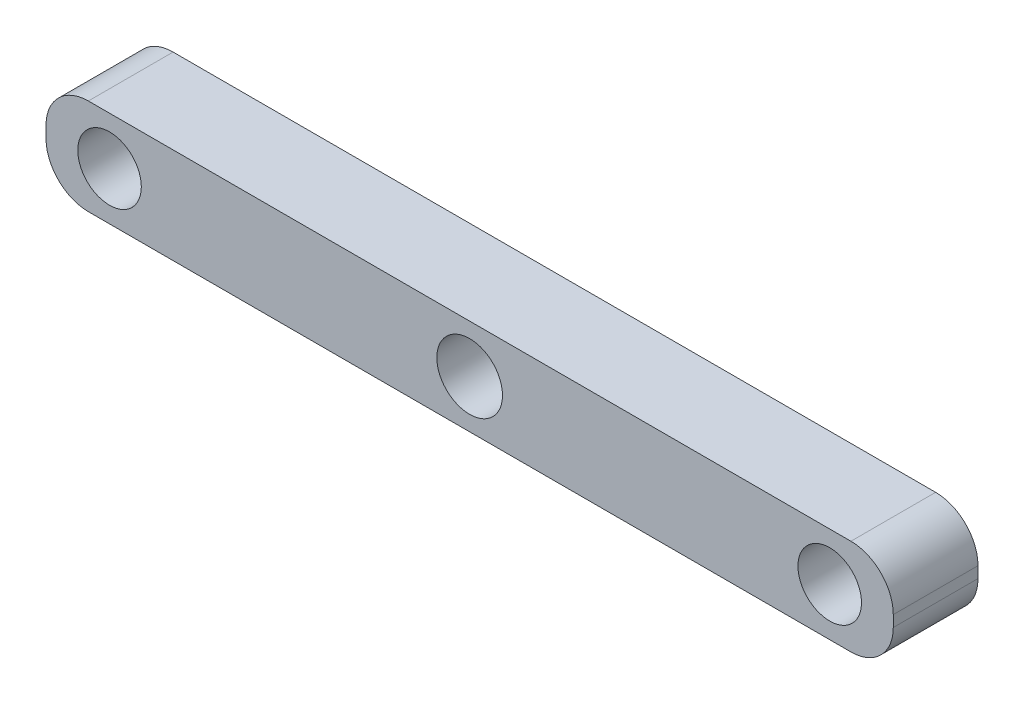
ISO-10303-21;
HEADER;
FILE_DESCRIPTION(('STEP AP214'),'2;1');
FILE_NAME('part.step','',(''),(''),'','','');
FILE_SCHEMA(('AUTOMOTIVE_DESIGN { 1 0 10303 214 1 1 1 1 }'));
ENDSEC;
DATA;
#1=APPLICATION_CONTEXT('core data for automotive mechanical design processes');
#2=APPLICATION_PROTOCOL_DEFINITION('international standard','automotive_design',2000,#1);
#3=PRODUCT_CONTEXT('',#1,'mechanical');
#4=PRODUCT('Part','Part','',(#3));
#5=PRODUCT_RELATED_PRODUCT_CATEGORY('part','',(#4));
#6=PRODUCT_DEFINITION_FORMATION('','',#4);
#7=PRODUCT_DEFINITION_CONTEXT('part definition',#1,'design');
#8=PRODUCT_DEFINITION('design','',#6,#7);
#9=PRODUCT_DEFINITION_SHAPE('','',#8);
#10=(LENGTH_UNIT() NAMED_UNIT(*) SI_UNIT(.MILLI.,.METRE.));
#11=(NAMED_UNIT(*) PLANE_ANGLE_UNIT() SI_UNIT($,.RADIAN.));
#12=(NAMED_UNIT(*) SI_UNIT($,.STERADIAN.) SOLID_ANGLE_UNIT());
#13=UNCERTAINTY_MEASURE_WITH_UNIT(LENGTH_MEASURE(1.E-05),#10,'distance_accuracy_value','');
#14=(GEOMETRIC_REPRESENTATION_CONTEXT(3) GLOBAL_UNCERTAINTY_ASSIGNED_CONTEXT((#13)) GLOBAL_UNIT_ASSIGNED_CONTEXT((#10,
#11,#12)) REPRESENTATION_CONTEXT('',''));
#15=CARTESIAN_POINT('',(0.,0.,0.));
#16=DIRECTION('',(0.,0.,1.));
#17=DIRECTION('',(1.,0.,0.));
#18=AXIS2_PLACEMENT_3D('',#15,#16,#17);
#19=CARTESIAN_POINT('',(18.,-0.263569898447118,4.));
#20=DIRECTION('',(0.,0.,1.));
#21=DIRECTION('',(1.,0.,0.));
#22=AXIS2_PLACEMENT_3D('',#19,#20,#21);
#23=PLANE('',#22);
#24=CARTESIAN_POINT('',(-17.,0.,4.));
#25=DIRECTION('',(0.,0.,1.));
#26=DIRECTION('',(1.,0.,0.));
#27=AXIS2_PLACEMENT_3D('',#24,#25,#26);
#28=CIRCLE('',#27,1.5);
#29=CARTESIAN_POINT('',(-15.5,0.,4.));
#30=VERTEX_POINT('',#29);
#31=EDGE_CURVE('E183',#30,#30,#28,.T.);
#32=ORIENTED_EDGE('',*,*,#31,.F.);
#33=EDGE_LOOP('',(#32));
#34=FACE_BOUND('',#33,.T.);
#35=CARTESIAN_POINT('',(18.,-0.263569898447118,4.));
#36=DIRECTION('',(0.,0.,1.));
#37=DIRECTION('',(1.,0.,0.));
#38=AXIS2_PLACEMENT_3D('',#35,#36,#37);
#39=CIRCLE('',#38,2.);
#40=CARTESIAN_POINT('',(18.,-2.26356989844712,4.));
#41=VERTEX_POINT('',#40);
#42=CARTESIAN_POINT('',(20.,-0.263569898447104,4.));
#43=VERTEX_POINT('',#42);
#44=EDGE_CURVE('E146',#41,#43,#39,.T.);
#45=ORIENTED_EDGE('',*,*,#44,.T.);
#46=DIRECTION('',(0.,1.,0.));
#47=VECTOR('',#46,1.);
#48=CARTESIAN_POINT('',(20.,-0.263569898447104,4.));
#49=LINE('',#48,#47);
#50=CARTESIAN_POINT('',(20.,0.263569898447104,4.));
#51=VERTEX_POINT('',#50);
#52=EDGE_CURVE('E94',#43,#51,#49,.T.);
#53=ORIENTED_EDGE('',*,*,#52,.T.);
#54=CARTESIAN_POINT('',(18.,0.263569898447118,4.));
#55=DIRECTION('',(0.,0.,1.));
#56=DIRECTION('',(-1.,0.,0.));
#57=AXIS2_PLACEMENT_3D('',#54,#55,#56);
#58=CIRCLE('',#57,2.);
#59=CARTESIAN_POINT('',(18.,2.26356989844712,4.));
#60=VERTEX_POINT('',#59);
#61=EDGE_CURVE('E161',#51,#60,#58,.T.);
#62=ORIENTED_EDGE('',*,*,#61,.T.);
#63=DIRECTION('',(-1.,0.,0.));
#64=VECTOR('',#63,1.);
#65=CARTESIAN_POINT('',(-18.,2.26356989844712,4.));
#66=LINE('',#65,#64);
#67=CARTESIAN_POINT('',(-18.,2.26356989844712,4.));
#68=VERTEX_POINT('',#67);
#69=EDGE_CURVE('E174',#60,#68,#66,.T.);
#70=ORIENTED_EDGE('',*,*,#69,.T.);
#71=CARTESIAN_POINT('',(-18.,0.263569898447118,4.));
#72=DIRECTION('',(0.,0.,1.));
#73=DIRECTION('',(-1.,0.,0.));
#74=AXIS2_PLACEMENT_3D('',#71,#72,#73);
#75=CIRCLE('',#74,2.);
#76=CARTESIAN_POINT('',(-20.,0.263569898447104,4.));
#77=VERTEX_POINT('',#76);
#78=EDGE_CURVE('E113',#68,#77,#75,.T.);
#79=ORIENTED_EDGE('',*,*,#78,.T.);
#80=DIRECTION('',(0.,-1.,0.));
#81=VECTOR('',#80,1.);
#82=CARTESIAN_POINT('',(-20.,-0.263569898447104,4.));
#83=LINE('',#82,#81);
#84=CARTESIAN_POINT('',(-20.,-0.263569898447118,4.));
#85=VERTEX_POINT('',#84);
#86=EDGE_CURVE('E107',#77,#85,#83,.T.);
#87=ORIENTED_EDGE('',*,*,#86,.T.);
#88=CARTESIAN_POINT('',(-18.,-0.263569898447118,4.));
#89=DIRECTION('',(0.,0.,1.));
#90=DIRECTION('',(-1.,0.,0.));
#91=AXIS2_PLACEMENT_3D('',#88,#89,#90);
#92=CIRCLE('',#91,2.);
#93=CARTESIAN_POINT('',(-18.,-2.26356989844712,4.));
#94=VERTEX_POINT('',#93);
#95=EDGE_CURVE('E111',#85,#94,#92,.T.);
#96=ORIENTED_EDGE('',*,*,#95,.T.);
#97=DIRECTION('',(1.,0.,0.));
#98=VECTOR('',#97,1.);
#99=CARTESIAN_POINT('',(-18.,-2.26356989844712,4.));
#100=LINE('',#99,#98);
#101=EDGE_CURVE('E51',#94,#41,#100,.T.);
#102=ORIENTED_EDGE('',*,*,#101,.T.);
#103=EDGE_LOOP('',(#45,#53,#62,#70,#79,#87,#96,#102));
#104=FACE_BOUND('',#103,.T.);
#105=CARTESIAN_POINT('',(0.,0.,4.));
#106=DIRECTION('',(0.,0.,1.));
#107=DIRECTION('',(1.,0.,0.));
#108=AXIS2_PLACEMENT_3D('',#105,#106,#107);
#109=CIRCLE('',#108,1.55);
#110=CARTESIAN_POINT('',(1.55,0.,4.));
#111=VERTEX_POINT('',#110);
#112=EDGE_CURVE('E135',#111,#111,#109,.T.);
#113=ORIENTED_EDGE('',*,*,#112,.F.);
#114=EDGE_LOOP('',(#113));
#115=FACE_BOUND('',#114,.T.);
#116=CARTESIAN_POINT('',(17.,0.,4.));
#117=DIRECTION('',(0.,0.,1.));
#118=DIRECTION('',(-1.,0.,0.));
#119=AXIS2_PLACEMENT_3D('',#116,#117,#118);
#120=CIRCLE('',#119,1.5);
#121=CARTESIAN_POINT('',(15.5,0.,4.));
#122=VERTEX_POINT('',#121);
#123=EDGE_CURVE('E189',#122,#122,#120,.T.);
#124=ORIENTED_EDGE('',*,*,#123,.F.);
#125=EDGE_LOOP('',(#124));
#126=FACE_BOUND('',#125,.T.);
#127=ADVANCED_FACE('F34',(#34,#104,#115,#126),#23,.T.);
#128=CARTESIAN_POINT('',(18.,-0.263569898447118,0.));
#129=DIRECTION('',(0.,0.,1.));
#130=DIRECTION('',(1.,0.,0.));
#131=AXIS2_PLACEMENT_3D('',#128,#129,#130);
#132=PLANE('',#131);
#133=CARTESIAN_POINT('',(18.,-0.263569898447118,0.));
#134=DIRECTION('',(0.,0.,1.));
#135=DIRECTION('',(1.,0.,0.));
#136=AXIS2_PLACEMENT_3D('',#133,#134,#135);
#137=CIRCLE('',#136,2.);
#138=CARTESIAN_POINT('',(18.,-2.26356989844712,0.));
#139=VERTEX_POINT('',#138);
#140=CARTESIAN_POINT('',(20.,-0.263569898447104,0.));
#141=VERTEX_POINT('',#140);
#142=EDGE_CURVE('E131',#139,#141,#137,.T.);
#143=ORIENTED_EDGE('',*,*,#142,.F.);
#144=DIRECTION('',(1.,0.,0.));
#145=VECTOR('',#144,1.);
#146=CARTESIAN_POINT('',(-18.,-2.26356989844712,0.));
#147=LINE('',#146,#145);
#148=CARTESIAN_POINT('',(-18.,-2.26356989844712,0.));
#149=VERTEX_POINT('',#148);
#150=EDGE_CURVE('E86',#149,#139,#147,.T.);
#151=ORIENTED_EDGE('',*,*,#150,.F.);
#152=CARTESIAN_POINT('',(-18.,-0.263569898447118,0.));
#153=DIRECTION('',(0.,0.,1.));
#154=DIRECTION('',(-1.,0.,0.));
#155=AXIS2_PLACEMENT_3D('',#152,#153,#154);
#156=CIRCLE('',#155,2.);
#157=CARTESIAN_POINT('',(-20.,-0.263569898447118,0.));
#158=VERTEX_POINT('',#157);
#159=EDGE_CURVE('E80',#158,#149,#156,.T.);
#160=ORIENTED_EDGE('',*,*,#159,.F.);
#161=DIRECTION('',(0.,-1.,0.));
#162=VECTOR('',#161,1.);
#163=CARTESIAN_POINT('',(-20.,-0.263569898447104,0.));
#164=LINE('',#163,#162);
#165=CARTESIAN_POINT('',(-20.,0.263569898447104,0.));
#166=VERTEX_POINT('',#165);
#167=EDGE_CURVE('E121',#166,#158,#164,.T.);
#168=ORIENTED_EDGE('',*,*,#167,.F.);
#169=CARTESIAN_POINT('',(-18.,0.263569898447118,0.));
#170=DIRECTION('',(0.,0.,1.));
#171=DIRECTION('',(-1.,0.,0.));
#172=AXIS2_PLACEMENT_3D('',#169,#170,#171);
#173=CIRCLE('',#172,2.);
#174=CARTESIAN_POINT('',(-18.,2.26356989844712,0.));
#175=VERTEX_POINT('',#174);
#176=EDGE_CURVE('E141',#175,#166,#173,.T.);
#177=ORIENTED_EDGE('',*,*,#176,.F.);
#178=DIRECTION('',(-1.,0.,0.));
#179=VECTOR('',#178,1.);
#180=CARTESIAN_POINT('',(-18.,2.26356989844712,0.));
#181=LINE('',#180,#179);
#182=CARTESIAN_POINT('',(18.,2.26356989844712,0.));
#183=VERTEX_POINT('',#182);
#184=EDGE_CURVE('E139',#183,#175,#181,.T.);
#185=ORIENTED_EDGE('',*,*,#184,.F.);
#186=CARTESIAN_POINT('',(18.,0.263569898447118,0.));
#187=DIRECTION('',(0.,0.,1.));
#188=DIRECTION('',(-1.,0.,0.));
#189=AXIS2_PLACEMENT_3D('',#186,#187,#188);
#190=CIRCLE('',#189,2.);
#191=CARTESIAN_POINT('',(20.,0.263569898447104,0.));
#192=VERTEX_POINT('',#191);
#193=EDGE_CURVE('E137',#192,#183,#190,.T.);
#194=ORIENTED_EDGE('',*,*,#193,.F.);
#195=DIRECTION('',(0.,1.,0.));
#196=VECTOR('',#195,1.);
#197=CARTESIAN_POINT('',(20.,-0.263569898447104,0.));
#198=LINE('',#197,#196);
#199=EDGE_CURVE('E134',#141,#192,#198,.T.);
#200=ORIENTED_EDGE('',*,*,#199,.F.);
#201=EDGE_LOOP('',(#143,#151,#160,#168,#177,#185,#194,#200));
#202=FACE_BOUND('',#201,.T.);
#203=CARTESIAN_POINT('',(0.,0.,0.));
#204=DIRECTION('',(0.,0.,1.));
#205=DIRECTION('',(1.,0.,0.));
#206=AXIS2_PLACEMENT_3D('',#203,#204,#205);
#207=CIRCLE('',#206,1.55);
#208=CARTESIAN_POINT('',(1.55,0.,0.));
#209=VERTEX_POINT('',#208);
#210=EDGE_CURVE('E180',#209,#209,#207,.T.);
#211=ORIENTED_EDGE('',*,*,#210,.T.);
#212=EDGE_LOOP('',(#211));
#213=FACE_BOUND('',#212,.T.);
#214=CARTESIAN_POINT('',(-17.,0.,0.));
#215=DIRECTION('',(0.,0.,1.));
#216=DIRECTION('',(1.,0.,0.));
#217=AXIS2_PLACEMENT_3D('',#214,#215,#216);
#218=CIRCLE('',#217,1.5);
#219=CARTESIAN_POINT('',(-15.5,0.,0.));
#220=VERTEX_POINT('',#219);
#221=EDGE_CURVE('E186',#220,#220,#218,.T.);
#222=ORIENTED_EDGE('',*,*,#221,.T.);
#223=EDGE_LOOP('',(#222));
#224=FACE_BOUND('',#223,.T.);
#225=CARTESIAN_POINT('',(17.,0.,0.));
#226=DIRECTION('',(0.,0.,1.));
#227=DIRECTION('',(-1.,0.,0.));
#228=AXIS2_PLACEMENT_3D('',#225,#226,#227);
#229=CIRCLE('',#228,1.5);
#230=CARTESIAN_POINT('',(15.5,0.,0.));
#231=VERTEX_POINT('',#230);
#232=EDGE_CURVE('E192',#231,#231,#229,.T.);
#233=ORIENTED_EDGE('',*,*,#232,.T.);
#234=EDGE_LOOP('',(#233));
#235=FACE_BOUND('',#234,.T.);
#236=ADVANCED_FACE('F165',(#202,#213,#224,#235),#132,.F.);
#237=CARTESIAN_POINT('',(18.,-0.263569898447118,4.));
#238=DIRECTION('',(0.,0.,-1.));
#239=DIRECTION('',(-1.,0.,0.));
#240=AXIS2_PLACEMENT_3D('',#237,#238,#239);
#241=CYLINDRICAL_SURFACE('',#240,2.);
#242=ORIENTED_EDGE('',*,*,#142,.T.);
#243=DIRECTION('',(0.,0.,-1.));
#244=VECTOR('',#243,1.);
#245=CARTESIAN_POINT('',(20.,-0.263569898447104,4.));
#246=LINE('',#245,#244);
#247=EDGE_CURVE('E11',#43,#141,#246,.T.);
#248=ORIENTED_EDGE('',*,*,#247,.F.);
#249=ORIENTED_EDGE('',*,*,#44,.F.);
#250=DIRECTION('',(0.,0.,-1.));
#251=VECTOR('',#250,1.);
#252=CARTESIAN_POINT('',(18.,-2.26356989844712,4.));
#253=LINE('',#252,#251);
#254=EDGE_CURVE('E127',#41,#139,#253,.T.);
#255=ORIENTED_EDGE('',*,*,#254,.T.);
#256=EDGE_LOOP('',(#242,#248,#249,#255));
#257=FACE_BOUND('',#256,.T.);
#258=ADVANCED_FACE('F36',(#257),#241,.T.);
#259=CARTESIAN_POINT('',(20.,-0.263569898447104,4.));
#260=DIRECTION('',(-1.,0.,0.));
#261=DIRECTION('',(0.,0.,1.));
#262=AXIS2_PLACEMENT_3D('',#259,#260,#261);
#263=PLANE('',#262);
#264=ORIENTED_EDGE('',*,*,#199,.T.);
#265=DIRECTION('',(0.,0.,-1.));
#266=VECTOR('',#265,1.);
#267=CARTESIAN_POINT('',(20.,0.263569898447104,4.));
#268=LINE('',#267,#266);
#269=EDGE_CURVE('E43',#51,#192,#268,.T.);
#270=ORIENTED_EDGE('',*,*,#269,.F.);
#271=ORIENTED_EDGE('',*,*,#52,.F.);
#272=ORIENTED_EDGE('',*,*,#247,.T.);
#273=EDGE_LOOP('',(#264,#270,#271,#272));
#274=FACE_BOUND('',#273,.T.);
#275=ADVANCED_FACE('F225',(#274),#263,.F.);
#276=CARTESIAN_POINT('',(18.,0.263569898447118,4.));
#277=DIRECTION('',(0.,0.,-1.));
#278=DIRECTION('',(-1.,0.,0.));
#279=AXIS2_PLACEMENT_3D('',#276,#277,#278);
#280=CYLINDRICAL_SURFACE('',#279,2.);
#281=ORIENTED_EDGE('',*,*,#193,.T.);
#282=DIRECTION('',(0.,0.,-1.));
#283=VECTOR('',#282,1.);
#284=CARTESIAN_POINT('',(18.,2.26356989844712,4.));
#285=LINE('',#284,#283);
#286=EDGE_CURVE('E153',#60,#183,#285,.T.);
#287=ORIENTED_EDGE('',*,*,#286,.F.);
#288=ORIENTED_EDGE('',*,*,#61,.F.);
#289=ORIENTED_EDGE('',*,*,#269,.T.);
#290=EDGE_LOOP('',(#281,#287,#288,#289));
#291=FACE_BOUND('',#290,.T.);
#292=ADVANCED_FACE('F159',(#291),#280,.T.);
#293=CARTESIAN_POINT('',(-18.,2.26356989844712,4.));
#294=DIRECTION('',(0.,-1.,0.));
#295=DIRECTION('',(0.,0.,-1.));
#296=AXIS2_PLACEMENT_3D('',#293,#294,#295);
#297=PLANE('',#296);
#298=ORIENTED_EDGE('',*,*,#184,.T.);
#299=DIRECTION('',(0.,0.,-1.));
#300=VECTOR('',#299,1.);
#301=CARTESIAN_POINT('',(-18.,2.26356989844712,4.));
#302=LINE('',#301,#300);
#303=EDGE_CURVE('E150',#68,#175,#302,.T.);
#304=ORIENTED_EDGE('',*,*,#303,.F.);
#305=ORIENTED_EDGE('',*,*,#69,.F.);
#306=ORIENTED_EDGE('',*,*,#286,.T.);
#307=EDGE_LOOP('',(#298,#304,#305,#306));
#308=FACE_BOUND('',#307,.T.);
#309=ADVANCED_FACE('F170',(#308),#297,.F.);
#310=CARTESIAN_POINT('',(-18.,0.263569898447118,4.));
#311=DIRECTION('',(0.,0.,-1.));
#312=DIRECTION('',(-1.,0.,0.));
#313=AXIS2_PLACEMENT_3D('',#310,#311,#312);
#314=CYLINDRICAL_SURFACE('',#313,2.);
#315=ORIENTED_EDGE('',*,*,#176,.T.);
#316=DIRECTION('',(0.,0.,-1.));
#317=VECTOR('',#316,1.);
#318=CARTESIAN_POINT('',(-20.,0.263569898447104,4.));
#319=LINE('',#318,#317);
#320=EDGE_CURVE('E122',#77,#166,#319,.T.);
#321=ORIENTED_EDGE('',*,*,#320,.F.);
#322=ORIENTED_EDGE('',*,*,#78,.F.);
#323=ORIENTED_EDGE('',*,*,#303,.T.);
#324=EDGE_LOOP('',(#315,#321,#322,#323));
#325=FACE_BOUND('',#324,.T.);
#326=ADVANCED_FACE('F173',(#325),#314,.T.);
#327=CARTESIAN_POINT('',(-20.,-0.263569898447104,4.));
#328=DIRECTION('',(1.,0.,0.));
#329=DIRECTION('',(0.,0.,-1.));
#330=AXIS2_PLACEMENT_3D('',#327,#328,#329);
#331=PLANE('',#330);
#332=ORIENTED_EDGE('',*,*,#167,.T.);
#333=DIRECTION('',(0.,0.,-1.));
#334=VECTOR('',#333,1.);
#335=CARTESIAN_POINT('',(-20.,-0.263569898447118,4.));
#336=LINE('',#335,#334);
#337=EDGE_CURVE('E118',#85,#158,#336,.T.);
#338=ORIENTED_EDGE('',*,*,#337,.F.);
#339=ORIENTED_EDGE('',*,*,#86,.F.);
#340=ORIENTED_EDGE('',*,*,#320,.T.);
#341=EDGE_LOOP('',(#332,#338,#339,#340));
#342=FACE_BOUND('',#341,.T.);
#343=ADVANCED_FACE('F119',(#342),#331,.F.);
#344=CARTESIAN_POINT('',(-18.,-0.263569898447118,4.));
#345=DIRECTION('',(0.,0.,-1.));
#346=DIRECTION('',(-1.,0.,0.));
#347=AXIS2_PLACEMENT_3D('',#344,#345,#346);
#348=CYLINDRICAL_SURFACE('',#347,2.);
#349=ORIENTED_EDGE('',*,*,#159,.T.);
#350=DIRECTION('',(0.,0.,-1.));
#351=VECTOR('',#350,1.);
#352=CARTESIAN_POINT('',(-18.,-2.26356989844712,4.));
#353=LINE('',#352,#351);
#354=EDGE_CURVE('E123',#94,#149,#353,.T.);
#355=ORIENTED_EDGE('',*,*,#354,.F.);
#356=ORIENTED_EDGE('',*,*,#95,.F.);
#357=ORIENTED_EDGE('',*,*,#337,.T.);
#358=EDGE_LOOP('',(#349,#355,#356,#357));
#359=FACE_BOUND('',#358,.T.);
#360=ADVANCED_FACE('F125',(#359),#348,.T.);
#361=CARTESIAN_POINT('',(-18.,-2.26356989844712,4.));
#362=DIRECTION('',(0.,1.,0.));
#363=DIRECTION('',(0.,0.,1.));
#364=AXIS2_PLACEMENT_3D('',#361,#362,#363);
#365=PLANE('',#364);
#366=ORIENTED_EDGE('',*,*,#150,.T.);
#367=ORIENTED_EDGE('',*,*,#254,.F.);
#368=ORIENTED_EDGE('',*,*,#101,.F.);
#369=ORIENTED_EDGE('',*,*,#354,.T.);
#370=EDGE_LOOP('',(#366,#367,#368,#369));
#371=FACE_BOUND('',#370,.T.);
#372=ADVANCED_FACE('F213',(#371),#365,.F.);
#373=CARTESIAN_POINT('',(0.,0.,4.));
#374=DIRECTION('',(0.,0.,-1.));
#375=DIRECTION('',(-1.,0.,0.));
#376=AXIS2_PLACEMENT_3D('',#373,#374,#375);
#377=CYLINDRICAL_SURFACE('',#376,1.55);
#378=ORIENTED_EDGE('',*,*,#112,.T.);
#379=EDGE_LOOP('',(#378));
#380=FACE_BOUND('',#379,.T.);
#381=ORIENTED_EDGE('',*,*,#210,.F.);
#382=EDGE_LOOP('',(#381));
#383=FACE_BOUND('',#382,.T.);
#384=ADVANCED_FACE('F210',(#380,#383),#377,.F.);
#385=CARTESIAN_POINT('',(-17.,0.,4.));
#386=DIRECTION('',(0.,0.,-1.));
#387=DIRECTION('',(-1.,0.,0.));
#388=AXIS2_PLACEMENT_3D('',#385,#386,#387);
#389=CYLINDRICAL_SURFACE('',#388,1.5);
#390=ORIENTED_EDGE('',*,*,#31,.T.);
#391=EDGE_LOOP('',(#390));
#392=FACE_BOUND('',#391,.T.);
#393=ORIENTED_EDGE('',*,*,#221,.F.);
#394=EDGE_LOOP('',(#393));
#395=FACE_BOUND('',#394,.T.);
#396=ADVANCED_FACE('F289',(#392,#395),#389,.F.);
#397=CARTESIAN_POINT('',(17.,0.,4.));
#398=DIRECTION('',(0.,0.,-1.));
#399=DIRECTION('',(-1.,0.,0.));
#400=AXIS2_PLACEMENT_3D('',#397,#398,#399);
#401=CYLINDRICAL_SURFACE('',#400,1.5);
#402=ORIENTED_EDGE('',*,*,#123,.T.);
#403=EDGE_LOOP('',(#402));
#404=FACE_BOUND('',#403,.T.);
#405=ORIENTED_EDGE('',*,*,#232,.F.);
#406=EDGE_LOOP('',(#405));
#407=FACE_BOUND('',#406,.T.);
#408=ADVANCED_FACE('F198',(#404,#407),#401,.F.);
#409=CLOSED_SHELL('',(#127,#236,#258,#275,#292,#309,#326,#343,#360,#372,#384,#396,#408));
#410=MANIFOLD_SOLID_BREP('B2',#409);
#411=ADVANCED_BREP_SHAPE_REPRESENTATION('',(#18,#410),#14);
#412=SHAPE_DEFINITION_REPRESENTATION(#9,#411);
ENDSEC;
END-ISO-10303-21;
